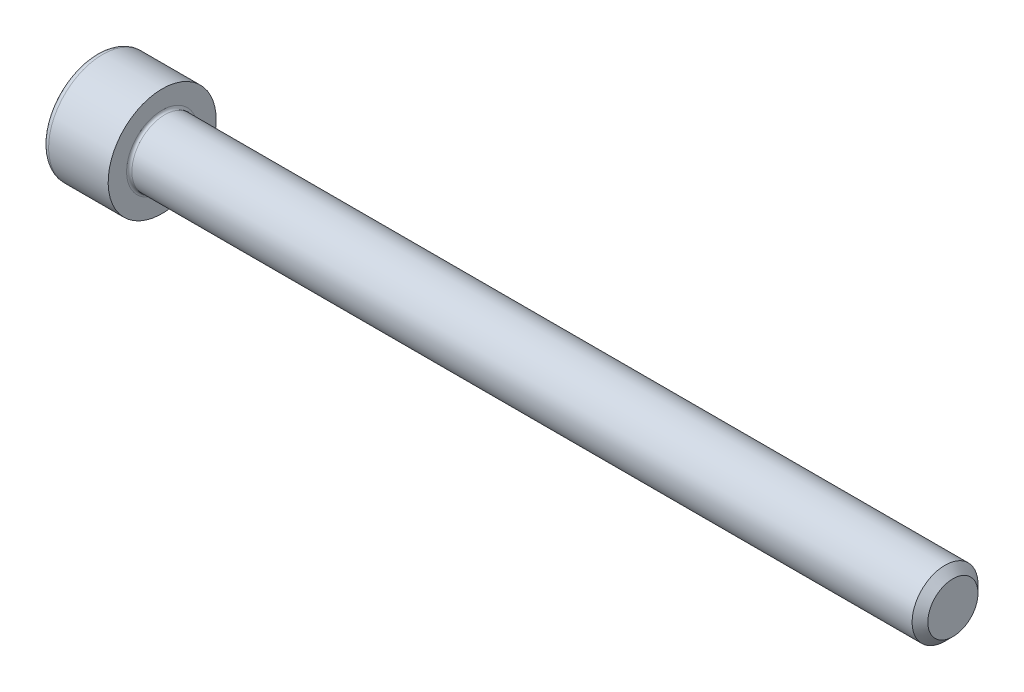
ISO-10303-21;
HEADER;
FILE_DESCRIPTION(('STEP AP214'),'2;1');
FILE_NAME('part.step','',(''),(''),'','','');
FILE_SCHEMA(('AUTOMOTIVE_DESIGN { 1 0 10303 214 1 1 1 1 }'));
ENDSEC;
DATA;
#1=APPLICATION_CONTEXT('core data for automotive mechanical design processes');
#2=APPLICATION_PROTOCOL_DEFINITION('international standard','automotive_design',2000,#1);
#3=PRODUCT_CONTEXT('',#1,'mechanical');
#4=PRODUCT('Part','Part','',(#3));
#5=PRODUCT_RELATED_PRODUCT_CATEGORY('part','',(#4));
#6=PRODUCT_DEFINITION_FORMATION('','',#4);
#7=PRODUCT_DEFINITION_CONTEXT('part definition',#1,'design');
#8=PRODUCT_DEFINITION('design','',#6,#7);
#9=PRODUCT_DEFINITION_SHAPE('','',#8);
#10=(LENGTH_UNIT() NAMED_UNIT(*) SI_UNIT(.MILLI.,.METRE.));
#11=(NAMED_UNIT(*) PLANE_ANGLE_UNIT() SI_UNIT($,.RADIAN.));
#12=(NAMED_UNIT(*) SI_UNIT($,.STERADIAN.) SOLID_ANGLE_UNIT());
#13=UNCERTAINTY_MEASURE_WITH_UNIT(LENGTH_MEASURE(1.E-05),#10,'distance_accuracy_value','');
#14=(GEOMETRIC_REPRESENTATION_CONTEXT(3) GLOBAL_UNCERTAINTY_ASSIGNED_CONTEXT((#13)) GLOBAL_UNIT_ASSIGNED_CONTEXT((#10,
#11,#12)) REPRESENTATION_CONTEXT('',''));
#15=CARTESIAN_POINT('',(0.,0.,0.));
#16=DIRECTION('',(0.,0.,1.));
#17=DIRECTION('',(1.,0.,0.));
#18=AXIS2_PLACEMENT_3D('',#15,#16,#17);
#19=CARTESIAN_POINT('',(-1.73197520098256,0.,0.));
#20=DIRECTION('',(-1.,0.,0.));
#21=DIRECTION('',(0.,0.,1.));
#22=AXIS2_PLACEMENT_3D('',#19,#20,#21);
#23=CONICAL_SURFACE('',#22,1.38675239139729,1.04719754955094);
#24=CARTESIAN_POINT('',(-0.931333331777751,0.,0.));
#25=VERTEX_POINT('',#24);
#26=VERTEX_LOOP('',#25);
#27=FACE_BOUND('',#26,.T.);
#28=CARTESIAN_POINT('',(-1.72720000120391,1.193800000022,-0.689240751313608));
#29=CARTESIAN_POINT('',(-1.7097081720049,1.14133971992733,-0.719528708168697));
#30=CARTESIAN_POINT('',(-1.69380026880719,1.08842660343091,-0.750078110230047));
#31=CARTESIAN_POINT('',(-1.66603350156342,0.981684215207318,-0.811705856811101));
#32=CARTESIAN_POINT('',(-1.65418445927501,0.927853047491819,-0.842785295980148));
#33=CARTESIAN_POINT('',(-1.63574057069848,0.820857814744278,-0.90455902240732));
#34=CARTESIAN_POINT('',(-1.62902295579597,0.767710207688869,-0.935243807648134));
#35=CARTESIAN_POINT('',(-1.62100502521491,0.66116504699521,-0.996757684855898));
#36=CARTESIAN_POINT('',(-1.61969806840361,0.607767880353934,-1.02758655339004));
#37=CARTESIAN_POINT('',(-1.62242392938177,0.508001002844588,-1.08518698697617));
#38=CARTESIAN_POINT('',(-1.62578745795185,0.461616321143432,-1.11196719544264));
#39=CARTESIAN_POINT('',(-1.63644571365033,0.369149138814387,-1.16535314805155));
#40=CARTESIAN_POINT('',(-1.64374407805462,0.323066957767086,-1.19195870768404));
#41=CARTESIAN_POINT('',(-1.6619885764635,0.230409284320977,-1.24545464039063));
#42=CARTESIAN_POINT('',(-1.67301201162178,0.183845513085448,-1.27233824624795));
#43=CARTESIAN_POINT('',(-1.69803054910868,0.0914122684013242,-1.3257046049484));
#44=CARTESIAN_POINT('',(-1.71201977684999,0.0455416116894897,-1.35218804094889));
#45=CARTESIAN_POINT('',(-1.72720000115406,5.87056396017049E-11,-1.37848150268325));
#46=B_SPLINE_CURVE_WITH_KNOTS('',3,(#28,#29,#30,#31,#32,#33,#34,#35,#36,#37,#38,#39,#40,#41,#42,
#43,#44,#45),.UNSPECIFIED.,.F.,.F.,(4,2,2,2,2,2,2,2,4),(0.,0.189226857426395,0.378908429643752,
0.563895970464692,0.748656387024744,0.909501175805916,1.0704949015411,1.23505869666435,
1.39929952252533),.UNSPECIFIED.);
#47=CARTESIAN_POINT('',(-1.72720000116295,1.19380000002009,-0.689240751286752));
#48=VERTEX_POINT('',#47);
#49=CARTESIAN_POINT('',(-1.72720000111504,-1.98927621491408E-11,-1.37848150263216));
#50=VERTEX_POINT('',#49);
#51=EDGE_CURVE('E58',#48,#50,#46,.T.);
#52=ORIENTED_EDGE('',*,*,#51,.T.);
#53=CARTESIAN_POINT('',(-1.72720000115425,-3.45734522083016E-11,-1.37848150267997));
#54=CARTESIAN_POINT('',(-1.70970817196307,-0.0524602801420712,-1.34819354584918));
#55=CARTESIAN_POINT('',(-1.69380026877027,-0.105373396642516,-1.31764414379851));
#56=CARTESIAN_POINT('',(-1.66603350153362,-0.212115784866326,-1.25601639722688));
#57=CARTESIAN_POINT('',(-1.65418445924743,-0.265946952577994,-1.22493695805653));
#58=CARTESIAN_POINT('',(-1.63574057067574,-0.372942185320122,-1.16316323162999));
#59=CARTESIAN_POINT('',(-1.62902295577587,-0.426089792373906,-1.13247844639101));
#60=CARTESIAN_POINT('',(-1.62100502519948,-0.532634953063572,-1.07096456918621));
#61=CARTESIAN_POINT('',(-1.61969806839022,-0.586032119702482,-1.04013570065319));
#62=CARTESIAN_POINT('',(-1.62242392937165,-0.685798997207228,-0.982535267069561));
#63=CARTESIAN_POINT('',(-1.62578745794302,-0.732183678906148,-0.955755058604433));
#64=CARTESIAN_POINT('',(-1.63644571364347,-0.824650861230668,-0.902369105998178));
#65=CARTESIAN_POINT('',(-1.64374407804845,-0.870733042275679,-0.875763546366991));
#66=CARTESIAN_POINT('',(-1.66198857645815,-0.963390715717013,-0.822267613663149));
#67=CARTESIAN_POINT('',(-1.67301201161653,-1.00995448695006,-0.795384007807267));
#68=CARTESIAN_POINT('',(-1.69803054910314,-1.10238773162928,-0.742017649109649));
#69=CARTESIAN_POINT('',(-1.71201977684406,-1.1482583883387,-0.715534213110564));
#70=CARTESIAN_POINT('',(-1.72720000114753,-1.19379999996711,-0.689240751377567));
#71=B_SPLINE_CURVE_WITH_KNOTS('',3,(#53,#54,#55,#56,#57,#58,#59,#60,#61,#62,#63,#64,#65,#66,#67,
#68,#69,#70),.UNSPECIFIED.,.F.,.F.,(4,2,2,2,2,2,2,2,4),(0.,0.189226857417322,0.37890842962568,
0.563895970438766,0.748656386990929,0.909501175764561,1.07049490149223,1.23505869660713,
1.39929952245974),.UNSPECIFIED.);
#72=CARTESIAN_POINT('',(-1.72720000115307,-1.19379999998372,-0.689240751367976));
#73=VERTEX_POINT('',#72);
#74=EDGE_CURVE('E234',#50,#73,#71,.T.);
#75=ORIENTED_EDGE('',*,*,#74,.T.);
#76=CARTESIAN_POINT('',(-1.72720000113908,-1.1938000000042,-0.689240751300846));
#77=CARTESIAN_POINT('',(-1.70970817195597,-1.19380000000151,-0.62866483762207));
#78=CARTESIAN_POINT('',(-1.69380026876678,-1.1938000000004,-0.567566033514464));
#79=CARTESIAN_POINT('',(-1.66603350153334,-1.19379999999959,-0.444310540368169));
#80=CARTESIAN_POINT('',(-1.65418445924673,-1.19379999999989,-0.382151662030761));
#81=CARTESIAN_POINT('',(-1.63574057067503,-1.1938000000001,-0.25860420918139));
#82=CARTESIAN_POINT('',(-1.62902295577558,-1.19380000000003,-0.19723463870394));
#83=CARTESIAN_POINT('',(-1.62100502519957,-1.19379999999997,-0.074206884296059));
#84=CARTESIAN_POINT('',(-1.61969806839028,-1.19379999999999,-0.0125491472312402));
#85=CARTESIAN_POINT('',(-1.62242392937151,-1.19380000000001,0.102651719933361));
#86=CARTESIAN_POINT('',(-1.62578745794269,-1.1938,0.156212136862171));
#87=CARTESIAN_POINT('',(-1.63644571364257,-1.1938,0.262984042071803));
#88=CARTESIAN_POINT('',(-1.64374407804715,-1.1938,0.316195161332748));
#89=CARTESIAN_POINT('',(-1.66198857645587,-1.1938,0.423187026737424));
#90=CARTESIAN_POINT('',(-1.67301201161365,-1.1938,0.476954238447612));
#91=CARTESIAN_POINT('',(-1.69803054909892,-1.1938,0.58368695583971));
#92=CARTESIAN_POINT('',(-1.7120197768391,-1.1938,0.63665382783632));
#93=CARTESIAN_POINT('',(-1.72720000114181,-1.1938,0.68924075130077));
#94=B_SPLINE_CURVE_WITH_KNOTS('',3,(#76,#77,#78,#79,#80,#81,#82,#83,#84,#85,#86,#87,#88,#89,#90,
#91,#92,#93),.UNSPECIFIED.,.F.,.F.,(4,2,2,2,2,2,2,2,4),(0.,0.189226857413111,0.378908429617606,
0.563895970427593,0.748656386976512,0.909501175745696,1.07049490146899,1.2350586965789,
1.39929952242642),.UNSPECIFIED.);
#95=CARTESIAN_POINT('',(-1.72720000114462,-1.19379999998371,0.689240751338735));
#96=VERTEX_POINT('',#95);
#97=EDGE_CURVE('E124',#73,#96,#94,.T.);
#98=ORIENTED_EDGE('',*,*,#97,.T.);
#99=CARTESIAN_POINT('',(-1.72720000114903,-1.19379999996592,0.689240751375564));
#100=CARTESIAN_POINT('',(-1.70970817196278,-1.14133971986335,0.719528708216263));
#101=CARTESIAN_POINT('',(-1.69380026877195,-1.08842660336523,0.750078110270817));
#102=CARTESIAN_POINT('',(-1.66603350153655,-0.981684215143713,0.81170585684497));
#103=CARTESIAN_POINT('',(-1.65418445924963,-0.927853047432004,0.842785296013926));
#104=CARTESIAN_POINT('',(-1.63574057067705,-0.820857814690295,0.904559022439224));
#105=CARTESIAN_POINT('',(-1.62902295577701,-0.767710207636954,0.935243807678304));
#106=CARTESIAN_POINT('',(-1.62100502520002,-0.661165046948017,0.996757684882949));
#107=CARTESIAN_POINT('',(-1.61969806839032,-0.607767880309394,1.02758655341571));
#108=CARTESIAN_POINT('',(-1.6224239293709,-0.508001002806194,1.08518698699838));
#109=CARTESIAN_POINT('',(-1.62578745794177,-0.461616321108528,1.11196719546281));
#110=CARTESIAN_POINT('',(-1.63644571364104,-0.369149138786451,1.16535314806766));
#111=CARTESIAN_POINT('',(-1.64374407804535,-0.323066957742628,1.19195870769816));
#112=CARTESIAN_POINT('',(-1.66198857645354,-0.230409284303761,1.24545464040057));
#113=CARTESIAN_POINT('',(-1.67301201161109,-0.183845513071992,1.27233824625572));
#114=CARTESIAN_POINT('',(-1.69803054909595,-0.0914122683952953,1.32570460495188));
#115=CARTESIAN_POINT('',(-1.71201977683595,-0.0455416116871275,1.35218804095025));
#116=CARTESIAN_POINT('',(-1.72720000113851,-5.99438804892789E-11,1.37848150268253));
#117=B_SPLINE_CURVE_WITH_KNOTS('',3,(#99,#100,#101,#102,#103,#104,#105,#106,#107,#108,#109,#110,
#111,#112,#113,#114,#115,#116),.UNSPECIFIED.,.F.,.F.,(4,2,2,2,2,2,2,2,4),(0.,0.189226857415646,
0.378908429622584,0.56389597043469,0.748656386985768,0.909501175755003,1.07049490147832,
1.23505869658839,1.39929952243612),.UNSPECIFIED.);
#118=CARTESIAN_POINT('',(-1.72720000123283,1.397589442688E-11,1.37848150275298));
#119=VERTEX_POINT('',#118);
#120=EDGE_CURVE('E130',#96,#119,#117,.T.);
#121=ORIENTED_EDGE('',*,*,#120,.T.);
#122=CARTESIAN_POINT('',(-1.72720000116221,5.55008980097434E-11,1.37848150266838));
#123=CARTESIAN_POINT('',(-1.70970817197141,0.0524602801626142,1.3481935458375));
#124=CARTESIAN_POINT('',(-1.69380026877895,0.10537339666275,1.31764414378688));
#125=CARTESIAN_POINT('',(-1.66603350154304,0.212115784885998,1.25601639721547));
#126=CARTESIAN_POINT('',(-1.65418445925723,0.265946952597415,1.2249369580453));
#127=CARTESIAN_POINT('',(-1.63574057068646,0.372942185339017,1.16316323161909));
#128=CARTESIAN_POINT('',(-1.62902295578712,0.426089792392526,1.13247844638027));
#129=CARTESIAN_POINT('',(-1.62100502521186,0.532634953081612,1.07096456917579));
#130=CARTESIAN_POINT('',(-1.61969806840321,0.586032119720216,1.04013570064295));
#131=CARTESIAN_POINT('',(-1.62242392938571,0.685798997221505,0.982535267061319));
#132=CARTESIAN_POINT('',(-1.62578745795728,0.732183678917287,0.955755058598002));
#133=CARTESIAN_POINT('',(-1.63644571365768,0.824650861235544,0.902369105995363));
#134=CARTESIAN_POINT('',(-1.64374407806239,0.870733042277431,0.87576354636598));
#135=CARTESIAN_POINT('',(-1.66198857647112,0.963390715712442,0.822267613665787));
#136=CARTESIAN_POINT('',(-1.67301201162879,1.00995448694229,0.79538400781175));
#137=CARTESIAN_POINT('',(-1.69803054911367,1.10238773161521,0.742017649117776));
#138=CARTESIAN_POINT('',(-1.71201977685356,1.14825838832151,0.715534213120488));
#139=CARTESIAN_POINT('',(-1.72720000115592,1.19379999994684,0.689240751389269));
#140=B_SPLINE_CURVE_WITH_KNOTS('',3,(#122,#123,#124,#125,#126,#127,#128,#129,#130,#131,#132,
#133,#134,#135,#136,#137,#138,#139),.UNSPECIFIED.,.F.,.F.,(4,2,2,2,2,2,2,2,4),(0.,
0.189226857416203,0.378908429623428,0.563895970435401,0.748656386986452,0.909501175749304,
1.07049490146616,1.23505869656981,1.39929952241122),.UNSPECIFIED.);
#141=CARTESIAN_POINT('',(-1.7272000011586,1.19379999997294,0.689240751353378));
#142=VERTEX_POINT('',#141);
#143=EDGE_CURVE('E136',#119,#142,#140,.T.);
#144=ORIENTED_EDGE('',*,*,#143,.T.);
#145=CARTESIAN_POINT('',(-1.72720000116132,1.19380000000048,0.689240751317015));
#146=CARTESIAN_POINT('',(-1.70970817197595,1.19380000000017,0.628664837638046));
#147=CARTESIAN_POINT('',(-1.69380026878537,1.19380000000005,0.567566033529999));
#148=CARTESIAN_POINT('',(-1.66603350154998,1.19379999999995,0.444310540382578));
#149=CARTESIAN_POINT('',(-1.65418445926282,1.19379999999999,0.382151662044484));
#150=CARTESIAN_POINT('',(-1.63574057069,1.19380000000001,0.25860420919382));
#151=CARTESIAN_POINT('',(-1.62902295578996,1.1938,0.197234638715765));
#152=CARTESIAN_POINT('',(-1.62100502521304,1.1938,0.0742068843066044));
#153=CARTESIAN_POINT('',(-1.61969806840341,1.1938,0.0125491472411112));
#154=CARTESIAN_POINT('',(-1.6224239293841,1.1938,-0.10265171991963));
#155=CARTESIAN_POINT('',(-1.62578745795464,1.1938,-0.156212136843913));
#156=CARTESIAN_POINT('',(-1.6364457136527,1.1938,-0.262984042044567));
#157=CARTESIAN_POINT('',(-1.6437440780561,1.1938,-0.31619516130106));
#158=CARTESIAN_POINT('',(-1.66198857646201,1.1938,-0.423187026696785));
#159=CARTESIAN_POINT('',(-1.67301201161815,1.1938,-0.476954238402478));
#160=CARTESIAN_POINT('',(-1.69803054909988,1.1938,-0.583686955785732));
#161=CARTESIAN_POINT('',(-1.71201977683815,1.1938,-0.636653827777994));
#162=CARTESIAN_POINT('',(-1.72720000113887,1.1938,-0.689240751238141));
#163=B_SPLINE_CURVE_WITH_KNOTS('',3,(#145,#146,#147,#148,#149,#150,#151,#152,#153,#154,#155,
#156,#157,#158,#159,#160,#161,#162),.UNSPECIFIED.,.F.,.F.,(4,2,2,2,2,2,2,2,4),(0.,
0.189226857415432,0.378908429622219,0.563895970434208,0.748656386985143,0.909501175740694,
1.07049490145029,1.23505869654602,1.39929952237947),.UNSPECIFIED.);
#164=EDGE_CURVE('E142',#142,#48,#163,.T.);
#165=ORIENTED_EDGE('',*,*,#164,.T.);
#166=EDGE_LOOP('',(#52,#75,#98,#121,#144,#165));
#167=FACE_BOUND('',#166,.T.);
#168=ADVANCED_FACE('F16',(#27,#167),#23,.F.);
#169=CARTESIAN_POINT('',(-3.175,0.,-1.37848150271716));
#170=DIRECTION('',(0.,-0.5,-0.866025403784438));
#171=DIRECTION('',(0.,0.866025403784438,-0.5));
#172=AXIS2_PLACEMENT_3D('',#169,#170,#171);
#173=PLANE('',#172);
#174=DIRECTION('',(0.,0.866025403784437,-0.500000000000003));
#175=VECTOR('',#174,1.);
#176=CARTESIAN_POINT('',(-3.175,-1.1938,-0.68924075135857));
#177=LINE('',#176,#175);
#178=CARTESIAN_POINT('',(-3.175,-1.1938,-0.68924075135857));
#179=VERTEX_POINT('',#178);
#180=CARTESIAN_POINT('',(-3.175,2.9883695750371E-11,-1.37848150270303));
#181=VERTEX_POINT('',#180);
#182=EDGE_CURVE('E118',#179,#181,#177,.T.);
#183=ORIENTED_EDGE('',*,*,#182,.F.);
#184=DIRECTION('',(1.,0.,0.));
#185=VECTOR('',#184,1.);
#186=CARTESIAN_POINT('',(-3.175,-1.1938,-0.68924075135857));
#187=LINE('',#186,#185);
#188=EDGE_CURVE('E115',#179,#73,#187,.T.);
#189=ORIENTED_EDGE('',*,*,#188,.T.);
#190=ORIENTED_EDGE('',*,*,#74,.F.);
#191=DIRECTION('',(1.,0.,0.));
#192=VECTOR('',#191,1.);
#193=CARTESIAN_POINT('',(-3.175,6.52058702171887E-11,-1.37848150267949));
#194=LINE('',#193,#192);
#195=EDGE_CURVE('E145',#50,#181,#194,.F.);
#196=ORIENTED_EDGE('',*,*,#195,.T.);
#197=EDGE_LOOP('',(#183,#189,#190,#196));
#198=FACE_BOUND('',#197,.T.);
#199=ADVANCED_FACE('F63',(#198),#173,.F.);
#200=CARTESIAN_POINT('',(-3.175,1.1938,-0.689240751358565));
#201=DIRECTION('',(0.,0.5,-0.866025403784439));
#202=DIRECTION('',(0.,0.866025403784439,0.5));
#203=AXIS2_PLACEMENT_3D('',#200,#201,#202);
#204=PLANE('',#203);
#205=DIRECTION('',(0.,0.866025403784436,0.500000000000004));
#206=VECTOR('',#205,1.);
#207=CARTESIAN_POINT('',(-3.175,0.,-1.37848150271715));
#208=LINE('',#207,#206);
#209=CARTESIAN_POINT('',(-3.175,1.1938,-0.689240751264436));
#210=VERTEX_POINT('',#209);
#211=EDGE_CURVE('E152',#181,#210,#208,.T.);
#212=ORIENTED_EDGE('',*,*,#211,.F.);
#213=ORIENTED_EDGE('',*,*,#195,.F.);
#214=ORIENTED_EDGE('',*,*,#51,.F.);
#215=DIRECTION('',(1.,0.,0.));
#216=VECTOR('',#215,1.);
#217=CARTESIAN_POINT('',(-3.175,1.1938,-0.689240751207958));
#218=LINE('',#217,#216);
#219=EDGE_CURVE('E139',#48,#210,#218,.F.);
#220=ORIENTED_EDGE('',*,*,#219,.T.);
#221=EDGE_LOOP('',(#212,#213,#214,#220));
#222=FACE_BOUND('',#221,.T.);
#223=ADVANCED_FACE('F69',(#222),#204,.F.);
#224=CARTESIAN_POINT('',(-3.175,1.1938,0.689240751358565));
#225=DIRECTION('',(0.,1.,0.));
#226=DIRECTION('',(0.,0.,1.));
#227=AXIS2_PLACEMENT_3D('',#224,#225,#226);
#228=PLANE('',#227);
#229=DIRECTION('',(0.,0.,1.));
#230=VECTOR('',#229,1.);
#231=CARTESIAN_POINT('',(-3.175,1.1938,0.));
#232=LINE('',#231,#230);
#233=CARTESIAN_POINT('',(-3.175,1.19379999995924,0.689240751382106));
#234=VERTEX_POINT('',#233);
#235=EDGE_CURVE('E168',#210,#234,#232,.T.);
#236=ORIENTED_EDGE('',*,*,#235,.F.);
#237=ORIENTED_EDGE('',*,*,#219,.F.);
#238=ORIENTED_EDGE('',*,*,#164,.F.);
#239=DIRECTION('',(1.,0.,0.));
#240=VECTOR('',#239,1.);
#241=CARTESIAN_POINT('',(-3.175,1.19379999993479,0.689240751396228));
#242=LINE('',#241,#240);
#243=EDGE_CURVE('E133',#142,#234,#242,.F.);
#244=ORIENTED_EDGE('',*,*,#243,.T.);
#245=EDGE_LOOP('',(#236,#237,#238,#244));
#246=FACE_BOUND('',#245,.T.);
#247=ADVANCED_FACE('F212',(#246),#228,.F.);
#248=CARTESIAN_POINT('',(-3.175,0.,1.37848150271716));
#249=DIRECTION('',(0.,0.5,0.866025403784438));
#250=DIRECTION('',(0.,-0.866025403784438,0.5));
#251=AXIS2_PLACEMENT_3D('',#248,#249,#250);
#252=PLANE('',#251);
#253=DIRECTION('',(0.,-0.866025403784437,0.500000000000003));
#254=VECTOR('',#253,1.);
#255=CARTESIAN_POINT('',(-3.175,1.1938,0.689240751358569));
#256=LINE('',#255,#254);
#257=CARTESIAN_POINT('',(-3.175,-4.07525570654505E-11,1.37848150269362));
#258=VERTEX_POINT('',#257);
#259=EDGE_CURVE('E163',#234,#258,#256,.T.);
#260=ORIENTED_EDGE('',*,*,#259,.F.);
#261=ORIENTED_EDGE('',*,*,#243,.F.);
#262=ORIENTED_EDGE('',*,*,#143,.F.);
#263=DIRECTION('',(1.,0.,0.));
#264=VECTOR('',#263,1.);
#265=CARTESIAN_POINT('',(-3.175,-6.52067375789267E-11,1.37848150267949));
#266=LINE('',#265,#264);
#267=EDGE_CURVE('E127',#119,#258,#266,.F.);
#268=ORIENTED_EDGE('',*,*,#267,.T.);
#269=EDGE_LOOP('',(#260,#261,#262,#268));
#270=FACE_BOUND('',#269,.T.);
#271=ADVANCED_FACE('F207',(#270),#252,.F.);
#272=CARTESIAN_POINT('',(-3.175,-1.1938,0.689240751358565));
#273=DIRECTION('',(0.,-0.5,0.866025403784439));
#274=DIRECTION('',(0.,-0.866025403784439,-0.5));
#275=AXIS2_PLACEMENT_3D('',#272,#273,#274);
#276=PLANE('',#275);
#277=DIRECTION('',(0.,-0.866025403784436,-0.500000000000004));
#278=VECTOR('',#277,1.);
#279=CARTESIAN_POINT('',(-3.175,0.,1.37848150271715));
#280=LINE('',#279,#278);
#281=CARTESIAN_POINT('',(-3.175,-1.1938,0.6892407513115));
#282=VERTEX_POINT('',#281);
#283=EDGE_CURVE('E158',#258,#282,#280,.T.);
#284=ORIENTED_EDGE('',*,*,#283,.F.);
#285=ORIENTED_EDGE('',*,*,#267,.F.);
#286=ORIENTED_EDGE('',*,*,#120,.F.);
#287=DIRECTION('',(1.,0.,0.));
#288=VECTOR('',#287,1.);
#289=CARTESIAN_POINT('',(-3.175,-1.1938,0.689240751283261));
#290=LINE('',#289,#288);
#291=EDGE_CURVE('E119',#96,#282,#290,.F.);
#292=ORIENTED_EDGE('',*,*,#291,.T.);
#293=EDGE_LOOP('',(#284,#285,#286,#292));
#294=FACE_BOUND('',#293,.T.);
#295=ADVANCED_FACE('F202',(#294),#276,.F.);
#296=CARTESIAN_POINT('',(-3.175,-1.1938,-0.689240751358565));
#297=DIRECTION('',(0.,-1.,0.));
#298=DIRECTION('',(0.,0.,-1.));
#299=AXIS2_PLACEMENT_3D('',#296,#297,#298);
#300=PLANE('',#299);
#301=DIRECTION('',(0.,0.,1.));
#302=VECTOR('',#301,1.);
#303=CARTESIAN_POINT('',(-3.175,-1.1938,0.));
#304=LINE('',#303,#302);
#305=EDGE_CURVE('E155',#282,#179,#304,.F.);
#306=ORIENTED_EDGE('',*,*,#305,.F.);
#307=ORIENTED_EDGE('',*,*,#291,.F.);
#308=ORIENTED_EDGE('',*,*,#97,.F.);
#309=ORIENTED_EDGE('',*,*,#188,.F.);
#310=EDGE_LOOP('',(#306,#307,#308,#309));
#311=FACE_BOUND('',#310,.T.);
#312=ADVANCED_FACE('F198',(#311),#300,.F.);
#313=CARTESIAN_POINT('',(-3.175,1.99099075135856,0.));
#314=DIRECTION('',(-1.,0.,0.));
#315=DIRECTION('',(0.,0.,1.));
#316=AXIS2_PLACEMENT_3D('',#313,#314,#315);
#317=PLANE('',#316);
#318=CARTESIAN_POINT('',(-3.175,0.,0.));
#319=DIRECTION('',(1.,0.,0.));
#320=DIRECTION('',(0.,1.,0.));
#321=AXIS2_PLACEMENT_3D('',#318,#319,#320);
#322=CIRCLE('',#321,2.2987);
#323=CARTESIAN_POINT('',(-3.175,2.2987,0.));
#324=VERTEX_POINT('',#323);
#325=EDGE_CURVE('E114',#324,#324,#322,.T.);
#326=ORIENTED_EDGE('',*,*,#325,.F.);
#327=EDGE_LOOP('',(#326));
#328=FACE_BOUND('',#327,.T.);
#329=ORIENTED_EDGE('',*,*,#283,.T.);
#330=ORIENTED_EDGE('',*,*,#305,.T.);
#331=ORIENTED_EDGE('',*,*,#182,.T.);
#332=ORIENTED_EDGE('',*,*,#211,.T.);
#333=ORIENTED_EDGE('',*,*,#235,.T.);
#334=ORIENTED_EDGE('',*,*,#259,.T.);
#335=EDGE_LOOP('',(#329,#330,#331,#332,#333,#334));
#336=FACE_BOUND('',#335,.T.);
#337=ADVANCED_FACE('F201',(#328,#336),#317,.T.);
#338=CARTESIAN_POINT('',(-2.8702,0.,0.));
#339=DIRECTION('',(1.,0.,0.));
#340=DIRECTION('',(0.,1.,0.));
#341=AXIS2_PLACEMENT_3D('',#338,#339,#340);
#342=TOROIDAL_SURFACE('',#341,2.2987,0.304800000000001);
#343=CARTESIAN_POINT('',(-2.8702,0.,0.));
#344=DIRECTION('',(1.,0.,0.));
#345=DIRECTION('',(0.,1.,0.));
#346=AXIS2_PLACEMENT_3D('',#343,#344,#345);
#347=CIRCLE('',#346,2.6035);
#348=CARTESIAN_POINT('',(-2.8702,2.6035,0.));
#349=VERTEX_POINT('',#348);
#350=EDGE_CURVE('E106',#349,#349,#347,.T.);
#351=ORIENTED_EDGE('',*,*,#350,.F.);
#352=EDGE_LOOP('',(#351));
#353=FACE_BOUND('',#352,.T.);
#354=ORIENTED_EDGE('',*,*,#325,.T.);
#355=EDGE_LOOP('',(#354));
#356=FACE_BOUND('',#355,.T.);
#357=ADVANCED_FACE('F227',(#353,#356),#342,.T.);
#358=CARTESIAN_POINT('',(-1.5875,0.,0.));
#359=DIRECTION('',(1.,0.,0.));
#360=DIRECTION('',(0.,1.,0.));
#361=AXIS2_PLACEMENT_3D('',#358,#359,#360);
#362=CYLINDRICAL_SURFACE('',#361,2.6035);
#363=ORIENTED_EDGE('',*,*,#350,.T.);
#364=EDGE_LOOP('',(#363));
#365=FACE_BOUND('',#364,.T.);
#366=CARTESIAN_POINT('',(0.,0.,0.));
#367=DIRECTION('',(1.,0.,0.));
#368=DIRECTION('',(0.,1.,0.));
#369=AXIS2_PLACEMENT_3D('',#366,#367,#368);
#370=CIRCLE('',#369,2.6035);
#371=CARTESIAN_POINT('',(0.,2.6035,0.));
#372=VERTEX_POINT('',#371);
#373=EDGE_CURVE('E105',#372,#372,#370,.T.);
#374=ORIENTED_EDGE('',*,*,#373,.F.);
#375=EDGE_LOOP('',(#374));
#376=FACE_BOUND('',#375,.T.);
#377=ADVANCED_FACE('F95',(#365,#376),#362,.T.);
#378=CARTESIAN_POINT('',(0.,2.0955,0.));
#379=DIRECTION('',(1.,0.,0.));
#380=DIRECTION('',(0.,0.,-1.));
#381=AXIS2_PLACEMENT_3D('',#378,#379,#380);
#382=PLANE('',#381);
#383=ORIENTED_EDGE('',*,*,#373,.T.);
#384=EDGE_LOOP('',(#383));
#385=FACE_BOUND('',#384,.T.);
#386=CARTESIAN_POINT('',(0.,0.,-1.7145));
#387=CARTESIAN_POINT('',(0.,-0.326289715358198,-1.71460094104784));
#388=CARTESIAN_POINT('',(0.,-0.631098379543831,-1.59412204217154));
#389=CARTESIAN_POINT('',(0.,-0.960409354197949,-1.46395834187053));
#390=CARTESIAN_POINT('',(0.,-1.21233457634433,-1.21233457634434));
#391=CARTESIAN_POINT('',(0.,-1.4628170645999,-0.962151818316986));
#392=CARTESIAN_POINT('',(0.,-1.59412204217153,-0.631098379543838));
#393=CARTESIAN_POINT('',(0.,-1.71430410099548,-0.328088664388155));
#394=CARTESIAN_POINT('',(0.,-1.7145,0.));
#395=CARTESIAN_POINT('',(0.,-1.71469468325752,0.326052549863015));
#396=CARTESIAN_POINT('',(0.,-1.59412204217154,0.631098379543832));
#397=CARTESIAN_POINT('',(0.,-1.46395834187052,0.960409354197955));
#398=CARTESIAN_POINT('',(0.,-1.21233457634434,1.21233457634434));
#399=CARTESIAN_POINT('',(0.,-0.962151818316757,1.46281706460014));
#400=CARTESIAN_POINT('',(0.,-0.631098379543834,1.59412204217154));
#401=CARTESIAN_POINT('',(0.,-0.327850468437184,1.7143985761173));
#402=CARTESIAN_POINT('',(0.,0.,1.7145));
#403=B_SPLINE_CURVE_WITH_KNOTS('',2,(#386,#387,#388,#389,#390,#391,#392,#393,#394,#395,#396,
#397,#398,#399,#400,#401,#402),.UNSPECIFIED.,.F.,.F.,(3,2,2,2,2,2,2,2,3),(0.,0.125,0.25,0.375,
0.5,0.625,0.75,0.875,1.),.UNSPECIFIED.);
#404=CARTESIAN_POINT('',(0.,0.,-1.7145));
#405=VERTEX_POINT('',#404);
#406=CARTESIAN_POINT('',(0.,0.,1.7145));
#407=VERTEX_POINT('',#406);
#408=EDGE_CURVE('E33',#405,#407,#403,.T.);
#409=ORIENTED_EDGE('',*,*,#408,.T.);
#410=CARTESIAN_POINT('',(0.,0.,1.7145));
#411=CARTESIAN_POINT('',(0.,0.326289715357781,1.71460094104784));
#412=CARTESIAN_POINT('',(0.,0.631098379543838,1.59412204217153));
#413=CARTESIAN_POINT('',(0.,0.960409354197525,1.46395834187087));
#414=CARTESIAN_POINT('',(0.,1.21233457634435,1.21233457634433));
#415=CARTESIAN_POINT('',(0.,1.46281723430445,0.962151648815585));
#416=CARTESIAN_POINT('',(0.,1.59412204217154,0.631098379543811));
#417=CARTESIAN_POINT('',(0.,1.71440574651085,0.327832153359984));
#418=CARTESIAN_POINT('',(0.,1.7145,0.));
#419=CARTESIAN_POINT('',(0.,1.71459381521109,-0.326307736135676));
#420=CARTESIAN_POINT('',(0.,1.59412204217153,-0.631098379543851));
#421=CARTESIAN_POINT('',(0.,1.46395834711083,-0.960409348951677));
#422=CARTESIAN_POINT('',(0.,1.21233457634432,-1.21233457634435));
#423=CARTESIAN_POINT('',(0.,0.962151818315899,-1.46281706460069));
#424=CARTESIAN_POINT('',(0.,0.631098379543827,-1.59412204217154));
#425=CARTESIAN_POINT('',(0.,0.327850468436701,-1.7143985761173));
#426=CARTESIAN_POINT('',(0.,0.,-1.7145));
#427=B_SPLINE_CURVE_WITH_KNOTS('',2,(#410,#411,#412,#413,#414,#415,#416,#417,#418,#419,#420,
#421,#422,#423,#424,#425,#426),.UNSPECIFIED.,.F.,.F.,(3,2,2,2,2,2,2,2,3),(0.,0.125,0.25,0.375,
0.5,0.625,0.75,0.875,1.),.UNSPECIFIED.);
#428=EDGE_CURVE('E102',#407,#405,#427,.T.);
#429=ORIENTED_EDGE('',*,*,#428,.T.);
#430=EDGE_LOOP('',(#409,#429));
#431=FACE_BOUND('',#430,.T.);
#432=ADVANCED_FACE('F90',(#385,#431),#382,.T.);
#433=CARTESIAN_POINT('',(38.1,0.79375,0.));
#434=DIRECTION('',(1.,0.,0.));
#435=DIRECTION('',(0.,0.,-1.));
#436=AXIS2_PLACEMENT_3D('',#433,#434,#435);
#437=PLANE('',#436);
#438=CARTESIAN_POINT('',(38.1000000001563,0.,0.));
#439=DIRECTION('',(-1.,0.,0.));
#440=DIRECTION('',(0.,0.,1.));
#441=AXIS2_PLACEMENT_3D('',#438,#439,#440);
#442=CIRCLE('',#441,1.20904000016253);
#443=CARTESIAN_POINT('',(38.1000000001563,0.,1.20904000016253));
#444=VERTEX_POINT('',#443);
#445=EDGE_CURVE('E179',#444,#444,#442,.T.);
#446=ORIENTED_EDGE('',*,*,#445,.F.);
#447=EDGE_LOOP('',(#446));
#448=FACE_BOUND('',#447,.T.);
#449=ADVANCED_FACE('F87',(#448),#437,.T.);
#450=CARTESIAN_POINT('',(0.127,0.,0.));
#451=DIRECTION('',(1.,0.,0.));
#452=DIRECTION('',(0.,1.,0.));
#453=AXIS2_PLACEMENT_3D('',#450,#451,#452);
#454=TOROIDAL_SURFACE('',#453,1.7145,0.127);
#455=ORIENTED_EDGE('',*,*,#408,.F.);
#456=ORIENTED_EDGE('',*,*,#428,.F.);
#457=EDGE_LOOP('',(#455,#456));
#458=FACE_BOUND('',#457,.T.);
#459=CARTESIAN_POINT('',(0.126999999999999,0.,0.));
#460=DIRECTION('',(1.,0.,0.));
#461=DIRECTION('',(0.,1.,0.));
#462=AXIS2_PLACEMENT_3D('',#459,#460,#461);
#463=CIRCLE('',#462,1.5875);
#464=CARTESIAN_POINT('',(0.126999999999999,1.5875,0.));
#465=VERTEX_POINT('',#464);
#466=EDGE_CURVE('E20',#465,#465,#463,.T.);
#467=ORIENTED_EDGE('',*,*,#466,.F.);
#468=EDGE_LOOP('',(#467));
#469=FACE_BOUND('',#468,.T.);
#470=ADVANCED_FACE('F18',(#458,#469),#454,.F.);
#471=CARTESIAN_POINT('',(37.7215399998363,0.,0.));
#472=DIRECTION('',(-1.,0.,0.));
#473=DIRECTION('',(0.,0.,1.));
#474=AXIS2_PLACEMENT_3D('',#471,#472,#473);
#475=CONICAL_SURFACE('',#474,1.58749999974361,0.78539816242117);
#476=CARTESIAN_POINT('',(37.72154,0.,0.));
#477=DIRECTION('',(1.,0.,0.));
#478=DIRECTION('',(0.,1.,0.));
#479=AXIS2_PLACEMENT_3D('',#476,#477,#478);
#480=CIRCLE('',#479,1.5875);
#481=CARTESIAN_POINT('',(37.72154,1.5875,0.));
#482=VERTEX_POINT('',#481);
#483=EDGE_CURVE('E11',#482,#482,#480,.F.);
#484=ORIENTED_EDGE('',*,*,#483,.F.);
#485=EDGE_LOOP('',(#484));
#486=FACE_BOUND('',#485,.T.);
#487=ORIENTED_EDGE('',*,*,#445,.T.);
#488=EDGE_LOOP('',(#487));
#489=FACE_BOUND('',#488,.T.);
#490=ADVANCED_FACE('F76',(#486,#489),#475,.T.);
#491=CARTESIAN_POINT('',(28.575,0.,0.));
#492=DIRECTION('',(1.,0.,0.));
#493=DIRECTION('',(0.,1.,0.));
#494=AXIS2_PLACEMENT_3D('',#491,#492,#493);
#495=CYLINDRICAL_SURFACE('',#494,1.5875);
#496=ORIENTED_EDGE('',*,*,#483,.T.);
#497=EDGE_LOOP('',(#496));
#498=FACE_BOUND('',#497,.T.);
#499=ORIENTED_EDGE('',*,*,#466,.T.);
#500=EDGE_LOOP('',(#499));
#501=FACE_BOUND('',#500,.T.);
#502=ADVANCED_FACE('F74',(#498,#501),#495,.T.);
#503=CLOSED_SHELL('',(#168,#199,#223,#247,#271,#295,#312,#337,#357,#377,#432,#449,#470,#490,#502));
#504=MANIFOLD_SOLID_BREP('B1',#503);
#505=ADVANCED_BREP_SHAPE_REPRESENTATION('',(#18,#504),#14);
#506=SHAPE_DEFINITION_REPRESENTATION(#9,#505);
ENDSEC;
END-ISO-10303-21;
